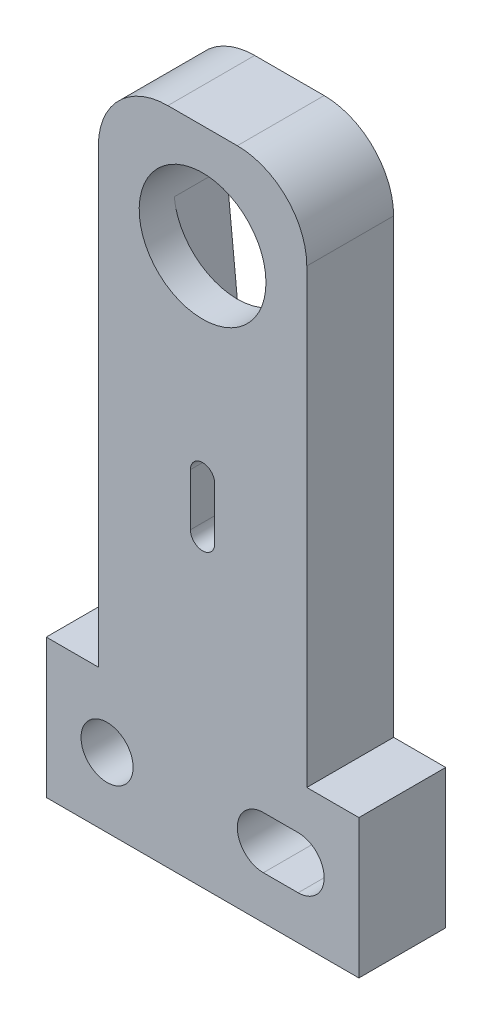
ISO-10303-21;
HEADER;
FILE_DESCRIPTION(('STEP AP214'),'2;1');
FILE_NAME('part.step','',(''),(''),'','','');
FILE_SCHEMA(('AUTOMOTIVE_DESIGN { 1 0 10303 214 1 1 1 1 }'));
ENDSEC;
DATA;
#1=APPLICATION_CONTEXT('core data for automotive mechanical design processes');
#2=APPLICATION_PROTOCOL_DEFINITION('international standard','automotive_design',2000,#1);
#3=PRODUCT_CONTEXT('',#1,'mechanical');
#4=PRODUCT('Part','Part','',(#3));
#5=PRODUCT_RELATED_PRODUCT_CATEGORY('part','',(#4));
#6=PRODUCT_DEFINITION_FORMATION('','',#4);
#7=PRODUCT_DEFINITION_CONTEXT('part definition',#1,'design');
#8=PRODUCT_DEFINITION('design','',#6,#7);
#9=PRODUCT_DEFINITION_SHAPE('','',#8);
#10=(LENGTH_UNIT() NAMED_UNIT(*) SI_UNIT(.MILLI.,.METRE.));
#11=(NAMED_UNIT(*) PLANE_ANGLE_UNIT() SI_UNIT($,.RADIAN.));
#12=(NAMED_UNIT(*) SI_UNIT($,.STERADIAN.) SOLID_ANGLE_UNIT());
#13=UNCERTAINTY_MEASURE_WITH_UNIT(LENGTH_MEASURE(1.E-05),#10,'distance_accuracy_value','');
#14=(GEOMETRIC_REPRESENTATION_CONTEXT(3) GLOBAL_UNCERTAINTY_ASSIGNED_CONTEXT((#13)) GLOBAL_UNIT_ASSIGNED_CONTEXT((#10,
#11,#12)) REPRESENTATION_CONTEXT('',''));
#15=CARTESIAN_POINT('',(0.,0.,0.));
#16=DIRECTION('',(0.,0.,1.));
#17=DIRECTION('',(1.,0.,0.));
#18=AXIS2_PLACEMENT_3D('',#15,#16,#17);
#19=CARTESIAN_POINT('',(0.,0.,5.));
#20=DIRECTION('',(0.,0.,-1.));
#21=DIRECTION('',(-1.,0.,0.));
#22=AXIS2_PLACEMENT_3D('',#19,#20,#21);
#23=CYLINDRICAL_SURFACE('',#22,3.65);
#24=CARTESIAN_POINT('',(0.,0.,5.));
#25=DIRECTION('',(0.,0.,1.));
#26=DIRECTION('',(1.,0.,0.));
#27=AXIS2_PLACEMENT_3D('',#24,#25,#26);
#28=CIRCLE('',#27,3.65);
#29=CARTESIAN_POINT('',(3.65,0.,5.));
#30=VERTEX_POINT('',#29);
#31=EDGE_CURVE('E382',#30,#30,#28,.T.);
#32=ORIENTED_EDGE('',*,*,#31,.T.);
#33=EDGE_LOOP('',(#32));
#34=FACE_BOUND('',#33,.T.);
#35=CARTESIAN_POINT('',(0.,0.,3.));
#36=DIRECTION('',(0.,0.,1.));
#37=DIRECTION('',(1.,0.,0.));
#38=AXIS2_PLACEMENT_3D('',#35,#36,#37);
#39=CIRCLE('',#38,3.65);
#40=CARTESIAN_POINT('',(-3.63170414543916,-0.365000000000001,3.));
#41=VERTEX_POINT('',#40);
#42=CARTESIAN_POINT('',(3.63170414543916,-0.365,3.));
#43=VERTEX_POINT('',#42);
#44=EDGE_CURVE('E408',#41,#43,#39,.T.);
#45=ORIENTED_EDGE('',*,*,#44,.F.);
#46=DIRECTION('',(0.,0.,-1.));
#47=VECTOR('',#46,1.);
#48=CARTESIAN_POINT('',(-3.63170414543916,-0.365000000000001,3.));
#49=LINE('',#48,#47);
#50=CARTESIAN_POINT('',(-3.63170414543916,-0.365000000000001,0.));
#51=VERTEX_POINT('',#50);
#52=EDGE_CURVE('E411',#41,#51,#49,.T.);
#53=ORIENTED_EDGE('',*,*,#52,.T.);
#54=CARTESIAN_POINT('',(0.,0.,0.));
#55=DIRECTION('',(0.,0.,1.));
#56=DIRECTION('',(1.,0.,0.));
#57=AXIS2_PLACEMENT_3D('',#54,#55,#56);
#58=CIRCLE('',#57,3.65);
#59=CARTESIAN_POINT('',(3.63170414543916,-0.365,0.));
#60=VERTEX_POINT('',#59);
#61=EDGE_CURVE('E258',#60,#51,#58,.T.);
#62=ORIENTED_EDGE('',*,*,#61,.F.);
#63=DIRECTION('',(0.,0.,-1.));
#64=VECTOR('',#63,1.);
#65=CARTESIAN_POINT('',(3.63170414543916,-0.365,3.));
#66=LINE('',#65,#64);
#67=EDGE_CURVE('E60',#43,#60,#66,.T.);
#68=ORIENTED_EDGE('',*,*,#67,.F.);
#69=EDGE_LOOP('',(#45,#53,#62,#68));
#70=FACE_BOUND('',#69,.T.);
#71=ADVANCED_FACE('F35',(#34,#70),#23,.F.);
#72=CARTESIAN_POINT('',(0.,0.,0.));
#73=DIRECTION('',(0.,0.,1.));
#74=DIRECTION('',(1.,0.,0.));
#75=AXIS2_PLACEMENT_3D('',#72,#73,#74);
#76=PLANE('',#75);
#77=CARTESIAN_POINT('',(-5.50000000000001,-28.,0.));
#78=DIRECTION('',(0.,0.,1.));
#79=DIRECTION('',(1.,0.,0.));
#80=AXIS2_PLACEMENT_3D('',#77,#78,#79);
#81=CIRCLE('',#80,1.5);
#82=CARTESIAN_POINT('',(-4.,-28.,0.));
#83=VERTEX_POINT('',#82);
#84=EDGE_CURVE('E261',#83,#83,#81,.T.);
#85=ORIENTED_EDGE('',*,*,#84,.T.);
#86=EDGE_LOOP('',(#85));
#87=FACE_BOUND('',#86,.T.);
#88=CARTESIAN_POINT('',(3.49999999999999,-28.,0.));
#89=DIRECTION('',(0.,0.,1.));
#90=DIRECTION('',(1.,0.,0.));
#91=AXIS2_PLACEMENT_3D('',#88,#89,#90);
#92=CIRCLE('',#91,1.5);
#93=CARTESIAN_POINT('',(3.49999999999999,-26.5,0.));
#94=VERTEX_POINT('',#93);
#95=CARTESIAN_POINT('',(3.49999999999999,-29.5,0.));
#96=VERTEX_POINT('',#95);
#97=EDGE_CURVE('E246',#94,#96,#92,.T.);
#98=ORIENTED_EDGE('',*,*,#97,.T.);
#99=DIRECTION('',(1.,0.,0.));
#100=VECTOR('',#99,1.);
#101=CARTESIAN_POINT('',(0.,-29.5,0.));
#102=LINE('',#101,#100);
#103=CARTESIAN_POINT('',(5.49999999999999,-29.5,0.));
#104=VERTEX_POINT('',#103);
#105=EDGE_CURVE('E255',#96,#104,#102,.T.);
#106=ORIENTED_EDGE('',*,*,#105,.T.);
#107=CARTESIAN_POINT('',(5.49999999999999,-28.,0.));
#108=DIRECTION('',(0.,0.,1.));
#109=DIRECTION('',(1.,0.,0.));
#110=AXIS2_PLACEMENT_3D('',#107,#108,#109);
#111=CIRCLE('',#110,1.5);
#112=CARTESIAN_POINT('',(5.49999999999999,-26.5,0.));
#113=VERTEX_POINT('',#112);
#114=EDGE_CURVE('E252',#104,#113,#111,.T.);
#115=ORIENTED_EDGE('',*,*,#114,.T.);
#116=DIRECTION('',(-1.,0.,0.));
#117=VECTOR('',#116,1.);
#118=CARTESIAN_POINT('',(0.,-26.5,0.));
#119=LINE('',#118,#117);
#120=EDGE_CURVE('E249',#113,#94,#119,.T.);
#121=ORIENTED_EDGE('',*,*,#120,.T.);
#122=EDGE_LOOP('',(#98,#106,#115,#121));
#123=FACE_BOUND('',#122,.T.);
#124=CARTESIAN_POINT('',(-2.,2.,0.));
#125=DIRECTION('',(0.,0.,1.));
#126=DIRECTION('',(1.,0.,0.));
#127=AXIS2_PLACEMENT_3D('',#124,#125,#126);
#128=CIRCLE('',#127,4.);
#129=CARTESIAN_POINT('',(-6.,2.,0.));
#130=VERTEX_POINT('',#129);
#131=CARTESIAN_POINT('',(-2.,6.,0.));
#132=VERTEX_POINT('',#131);
#133=EDGE_CURVE('E220',#130,#132,#128,.F.);
#134=ORIENTED_EDGE('',*,*,#133,.T.);
#135=DIRECTION('',(1.,0.,0.));
#136=VECTOR('',#135,1.);
#137=CARTESIAN_POINT('',(0.,6.,0.));
#138=LINE('',#137,#136);
#139=CARTESIAN_POINT('',(2.,6.,0.));
#140=VERTEX_POINT('',#139);
#141=EDGE_CURVE('E243',#132,#140,#138,.T.);
#142=ORIENTED_EDGE('',*,*,#141,.T.);
#143=CARTESIAN_POINT('',(2.,2.,0.));
#144=DIRECTION('',(0.,0.,1.));
#145=DIRECTION('',(1.,0.,0.));
#146=AXIS2_PLACEMENT_3D('',#143,#144,#145);
#147=CIRCLE('',#146,4.);
#148=CARTESIAN_POINT('',(6.,2.,0.));
#149=VERTEX_POINT('',#148);
#150=EDGE_CURVE('E240',#149,#140,#147,.T.);
#151=ORIENTED_EDGE('',*,*,#150,.F.);
#152=DIRECTION('',(0.,-1.,0.));
#153=VECTOR('',#152,1.);
#154=CARTESIAN_POINT('',(6.,0.,0.));
#155=LINE('',#154,#153);
#156=CARTESIAN_POINT('',(6.,-24.,0.));
#157=VERTEX_POINT('',#156);
#158=EDGE_CURVE('E237',#149,#157,#155,.T.);
#159=ORIENTED_EDGE('',*,*,#158,.T.);
#160=DIRECTION('',(-1.,0.,0.));
#161=VECTOR('',#160,1.);
#162=CARTESIAN_POINT('',(0.,-24.,0.));
#163=LINE('',#162,#161);
#164=CARTESIAN_POINT('',(9.,-24.,0.));
#165=VERTEX_POINT('',#164);
#166=EDGE_CURVE('E234',#165,#157,#163,.T.);
#167=ORIENTED_EDGE('',*,*,#166,.F.);
#168=DIRECTION('',(0.,1.,0.));
#169=VECTOR('',#168,1.);
#170=CARTESIAN_POINT('',(9.,0.,0.));
#171=LINE('',#170,#169);
#172=CARTESIAN_POINT('',(9.,-32.,0.));
#173=VERTEX_POINT('',#172);
#174=EDGE_CURVE('E232',#173,#165,#171,.T.);
#175=ORIENTED_EDGE('',*,*,#174,.F.);
#176=DIRECTION('',(1.,0.,0.));
#177=VECTOR('',#176,1.);
#178=CARTESIAN_POINT('',(0.,-32.,0.));
#179=LINE('',#178,#177);
#180=CARTESIAN_POINT('',(-8.99999999999999,-32.,0.));
#181=VERTEX_POINT('',#180);
#182=EDGE_CURVE('E230',#181,#173,#179,.T.);
#183=ORIENTED_EDGE('',*,*,#182,.F.);
#184=DIRECTION('',(0.,-1.,0.));
#185=VECTOR('',#184,1.);
#186=CARTESIAN_POINT('',(-8.99999999999999,0.,0.));
#187=LINE('',#186,#185);
#188=CARTESIAN_POINT('',(-8.99999999999999,-24.,0.));
#189=VERTEX_POINT('',#188);
#190=EDGE_CURVE('E228',#189,#181,#187,.T.);
#191=ORIENTED_EDGE('',*,*,#190,.F.);
#192=DIRECTION('',(-1.,0.,0.));
#193=VECTOR('',#192,1.);
#194=CARTESIAN_POINT('',(0.,-24.,0.));
#195=LINE('',#194,#193);
#196=CARTESIAN_POINT('',(-6.,-24.,0.));
#197=VERTEX_POINT('',#196);
#198=EDGE_CURVE('E226',#197,#189,#195,.T.);
#199=ORIENTED_EDGE('',*,*,#198,.F.);
#200=DIRECTION('',(0.,-1.,0.));
#201=VECTOR('',#200,1.);
#202=CARTESIAN_POINT('',(-6.,0.,0.));
#203=LINE('',#202,#201);
#204=EDGE_CURVE('E223',#130,#197,#203,.T.);
#205=ORIENTED_EDGE('',*,*,#204,.F.);
#206=EDGE_LOOP('',(#134,#142,#151,#159,#167,#175,#183,#191,#199,#205));
#207=FACE_BOUND('',#206,.T.);
#208=DIRECTION('',(0.1,-0.99498743710662,0.));
#209=VECTOR('',#208,1.);
#210=CARTESIAN_POINT('',(-3.63170414543916,-0.365,0.));
#211=LINE('',#210,#209);
#212=CARTESIAN_POINT('',(-2.23872173348989,-14.225,0.));
#213=VERTEX_POINT('',#212);
#214=EDGE_CURVE('E412',#51,#213,#211,.T.);
#215=ORIENTED_EDGE('',*,*,#214,.T.);
#216=CARTESIAN_POINT('',(0.,-14.,0.));
#217=DIRECTION('',(0.,0.,1.));
#218=DIRECTION('',(1.,0.,0.));
#219=AXIS2_PLACEMENT_3D('',#216,#217,#218);
#220=CIRCLE('',#219,2.25);
#221=CARTESIAN_POINT('',(2.2387217334899,-14.225,0.));
#222=VERTEX_POINT('',#221);
#223=EDGE_CURVE('E415',#213,#222,#220,.T.);
#224=ORIENTED_EDGE('',*,*,#223,.T.);
#225=DIRECTION('',(0.0999999999999999,0.99498743710662,0.));
#226=VECTOR('',#225,1.);
#227=CARTESIAN_POINT('',(3.63170414543916,-0.364999999999999,0.));
#228=LINE('',#227,#226);
#229=EDGE_CURVE('E200',#222,#60,#228,.T.);
#230=ORIENTED_EDGE('',*,*,#229,.T.);
#231=ORIENTED_EDGE('',*,*,#61,.T.);
#232=EDGE_LOOP('',(#215,#224,#230,#231));
#233=FACE_BOUND('',#232,.T.);
#234=ADVANCED_FACE('F312',(#87,#123,#207,#233),#76,.F.);
#235=CARTESIAN_POINT('',(0.,-11.5,5.));
#236=DIRECTION('',(0.,0.,-1.));
#237=DIRECTION('',(-1.,0.,0.));
#238=AXIS2_PLACEMENT_3D('',#235,#236,#237);
#239=CYLINDRICAL_SURFACE('',#238,0.7);
#240=CARTESIAN_POINT('',(0.,-11.5,3.));
#241=DIRECTION('',(0.,0.,1.));
#242=DIRECTION('',(1.,0.,0.));
#243=AXIS2_PLACEMENT_3D('',#240,#241,#242);
#244=CIRCLE('',#243,0.7);
#245=CARTESIAN_POINT('',(0.7,-11.5,3.));
#246=VERTEX_POINT('',#245);
#247=CARTESIAN_POINT('',(-0.7,-11.5,3.));
#248=VERTEX_POINT('',#247);
#249=EDGE_CURVE('E52',#246,#248,#244,.T.);
#250=ORIENTED_EDGE('',*,*,#249,.F.);
#251=DIRECTION('',(0.,0.,-1.));
#252=VECTOR('',#251,1.);
#253=CARTESIAN_POINT('',(0.7,-11.5,5.));
#254=LINE('',#253,#252);
#255=CARTESIAN_POINT('',(0.7,-11.5,5.));
#256=VERTEX_POINT('',#255);
#257=EDGE_CURVE('E11',#256,#246,#254,.T.);
#258=ORIENTED_EDGE('',*,*,#257,.F.);
#259=CARTESIAN_POINT('',(0.,-11.5,5.));
#260=DIRECTION('',(0.,0.,1.));
#261=DIRECTION('',(1.,0.,0.));
#262=AXIS2_PLACEMENT_3D('',#259,#260,#261);
#263=CIRCLE('',#262,0.7);
#264=CARTESIAN_POINT('',(-0.7,-11.5,5.));
#265=VERTEX_POINT('',#264);
#266=EDGE_CURVE('E210',#256,#265,#263,.T.);
#267=ORIENTED_EDGE('',*,*,#266,.T.);
#268=DIRECTION('',(0.,0.,-1.));
#269=VECTOR('',#268,1.);
#270=CARTESIAN_POINT('',(-0.7,-11.5,5.));
#271=LINE('',#270,#269);
#272=EDGE_CURVE('E199',#265,#248,#271,.T.);
#273=ORIENTED_EDGE('',*,*,#272,.T.);
#274=EDGE_LOOP('',(#250,#258,#267,#273));
#275=FACE_BOUND('',#274,.T.);
#276=ADVANCED_FACE('F195',(#275),#239,.F.);
#277=CARTESIAN_POINT('',(0.699999999999998,0.,5.));
#278=DIRECTION('',(-1.,0.,0.));
#279=DIRECTION('',(0.,-1.,0.));
#280=AXIS2_PLACEMENT_3D('',#277,#278,#279);
#281=PLANE('',#280);
#282=DIRECTION('',(0.,1.,0.));
#283=VECTOR('',#282,1.);
#284=CARTESIAN_POINT('',(0.699999999999998,0.,3.));
#285=LINE('',#284,#283);
#286=CARTESIAN_POINT('',(0.700000000000001,-14.5,3.));
#287=VERTEX_POINT('',#286);
#288=EDGE_CURVE('E185',#287,#246,#285,.T.);
#289=ORIENTED_EDGE('',*,*,#288,.F.);
#290=DIRECTION('',(0.,0.,-1.));
#291=VECTOR('',#290,1.);
#292=CARTESIAN_POINT('',(0.700000000000001,-14.5,5.));
#293=LINE('',#292,#291);
#294=CARTESIAN_POINT('',(0.700000000000001,-14.5,5.));
#295=VERTEX_POINT('',#294);
#296=EDGE_CURVE('E44',#295,#287,#293,.T.);
#297=ORIENTED_EDGE('',*,*,#296,.F.);
#298=DIRECTION('',(0.,1.,0.));
#299=VECTOR('',#298,1.);
#300=CARTESIAN_POINT('',(0.699999999999998,0.,5.));
#301=LINE('',#300,#299);
#302=EDGE_CURVE('E205',#295,#256,#301,.T.);
#303=ORIENTED_EDGE('',*,*,#302,.T.);
#304=ORIENTED_EDGE('',*,*,#257,.T.);
#305=EDGE_LOOP('',(#289,#297,#303,#304));
#306=FACE_BOUND('',#305,.T.);
#307=ADVANCED_FACE('F203',(#306),#281,.T.);
#308=CARTESIAN_POINT('',(0.,-14.5,5.));
#309=DIRECTION('',(0.,0.,-1.));
#310=DIRECTION('',(-1.,0.,0.));
#311=AXIS2_PLACEMENT_3D('',#308,#309,#310);
#312=CYLINDRICAL_SURFACE('',#311,0.7);
#313=CARTESIAN_POINT('',(0.,-14.5,3.));
#314=DIRECTION('',(0.,0.,1.));
#315=DIRECTION('',(1.,0.,0.));
#316=AXIS2_PLACEMENT_3D('',#313,#314,#315);
#317=CIRCLE('',#316,0.7);
#318=CARTESIAN_POINT('',(-0.699999999999999,-14.5,3.));
#319=VERTEX_POINT('',#318);
#320=EDGE_CURVE('E189',#319,#287,#317,.T.);
#321=ORIENTED_EDGE('',*,*,#320,.F.);
#322=DIRECTION('',(0.,0.,-1.));
#323=VECTOR('',#322,1.);
#324=CARTESIAN_POINT('',(-0.699999999999999,-14.5,5.));
#325=LINE('',#324,#323);
#326=CARTESIAN_POINT('',(-0.699999999999999,-14.5,5.));
#327=VERTEX_POINT('',#326);
#328=EDGE_CURVE('E266',#327,#319,#325,.T.);
#329=ORIENTED_EDGE('',*,*,#328,.F.);
#330=CARTESIAN_POINT('',(0.,-14.5,5.));
#331=DIRECTION('',(0.,0.,1.));
#332=DIRECTION('',(1.,0.,0.));
#333=AXIS2_PLACEMENT_3D('',#330,#331,#332);
#334=CIRCLE('',#333,0.7);
#335=EDGE_CURVE('E209',#327,#295,#334,.T.);
#336=ORIENTED_EDGE('',*,*,#335,.T.);
#337=ORIENTED_EDGE('',*,*,#296,.T.);
#338=EDGE_LOOP('',(#321,#329,#336,#337));
#339=FACE_BOUND('',#338,.T.);
#340=ADVANCED_FACE('F470',(#339),#312,.F.);
#341=CARTESIAN_POINT('',(3.49999999999999,-28.,5.));
#342=DIRECTION('',(0.,0.,-1.));
#343=DIRECTION('',(-1.,0.,0.));
#344=AXIS2_PLACEMENT_3D('',#341,#342,#343);
#345=CYLINDRICAL_SURFACE('',#344,1.5);
#346=ORIENTED_EDGE('',*,*,#97,.F.);
#347=DIRECTION('',(0.,0.,-1.));
#348=VECTOR('',#347,1.);
#349=CARTESIAN_POINT('',(3.49999999999999,-26.5,5.));
#350=LINE('',#349,#348);
#351=CARTESIAN_POINT('',(3.49999999999999,-26.5,5.));
#352=VERTEX_POINT('',#351);
#353=EDGE_CURVE('E267',#352,#94,#350,.T.);
#354=ORIENTED_EDGE('',*,*,#353,.F.);
#355=CARTESIAN_POINT('',(3.49999999999999,-28.,5.));
#356=DIRECTION('',(0.,0.,1.));
#357=DIRECTION('',(1.,0.,0.));
#358=AXIS2_PLACEMENT_3D('',#355,#356,#357);
#359=CIRCLE('',#358,1.5);
#360=CARTESIAN_POINT('',(3.49999999999999,-29.5,5.));
#361=VERTEX_POINT('',#360);
#362=EDGE_CURVE('E370',#352,#361,#359,.T.);
#363=ORIENTED_EDGE('',*,*,#362,.T.);
#364=DIRECTION('',(0.,0.,-1.));
#365=VECTOR('',#364,1.);
#366=CARTESIAN_POINT('',(3.49999999999999,-29.5,5.));
#367=LINE('',#366,#365);
#368=EDGE_CURVE('E271',#361,#96,#367,.T.);
#369=ORIENTED_EDGE('',*,*,#368,.T.);
#370=EDGE_LOOP('',(#346,#354,#363,#369));
#371=FACE_BOUND('',#370,.T.);
#372=ADVANCED_FACE('F466',(#371),#345,.F.);
#373=CARTESIAN_POINT('',(0.,-26.5,5.));
#374=DIRECTION('',(0.,-1.,0.));
#375=DIRECTION('',(0.,0.,-1.));
#376=AXIS2_PLACEMENT_3D('',#373,#374,#375);
#377=PLANE('',#376);
#378=ORIENTED_EDGE('',*,*,#120,.F.);
#379=DIRECTION('',(0.,0.,-1.));
#380=VECTOR('',#379,1.);
#381=CARTESIAN_POINT('',(5.49999999999999,-26.5,5.));
#382=LINE('',#381,#380);
#383=CARTESIAN_POINT('',(5.49999999999999,-26.5,5.));
#384=VERTEX_POINT('',#383);
#385=EDGE_CURVE('E275',#384,#113,#382,.T.);
#386=ORIENTED_EDGE('',*,*,#385,.F.);
#387=DIRECTION('',(-1.,0.,0.));
#388=VECTOR('',#387,1.);
#389=CARTESIAN_POINT('',(0.,-26.5,5.));
#390=LINE('',#389,#388);
#391=EDGE_CURVE('E373',#384,#352,#390,.T.);
#392=ORIENTED_EDGE('',*,*,#391,.T.);
#393=ORIENTED_EDGE('',*,*,#353,.T.);
#394=EDGE_LOOP('',(#378,#386,#392,#393));
#395=FACE_BOUND('',#394,.T.);
#396=ADVANCED_FACE('F462',(#395),#377,.T.);
#397=CARTESIAN_POINT('',(5.49999999999999,-28.,5.));
#398=DIRECTION('',(0.,0.,-1.));
#399=DIRECTION('',(-1.,0.,0.));
#400=AXIS2_PLACEMENT_3D('',#397,#398,#399);
#401=CYLINDRICAL_SURFACE('',#400,1.5);
#402=ORIENTED_EDGE('',*,*,#114,.F.);
#403=DIRECTION('',(0.,0.,-1.));
#404=VECTOR('',#403,1.);
#405=CARTESIAN_POINT('',(5.49999999999999,-29.5,5.));
#406=LINE('',#405,#404);
#407=CARTESIAN_POINT('',(5.49999999999999,-29.5,5.));
#408=VERTEX_POINT('',#407);
#409=EDGE_CURVE('E273',#408,#104,#406,.T.);
#410=ORIENTED_EDGE('',*,*,#409,.F.);
#411=CARTESIAN_POINT('',(5.49999999999999,-28.,5.));
#412=DIRECTION('',(0.,0.,1.));
#413=DIRECTION('',(1.,0.,0.));
#414=AXIS2_PLACEMENT_3D('',#411,#412,#413);
#415=CIRCLE('',#414,1.5);
#416=EDGE_CURVE('E376',#408,#384,#415,.T.);
#417=ORIENTED_EDGE('',*,*,#416,.T.);
#418=ORIENTED_EDGE('',*,*,#385,.T.);
#419=EDGE_LOOP('',(#402,#410,#417,#418));
#420=FACE_BOUND('',#419,.T.);
#421=ADVANCED_FACE('F459',(#420),#401,.F.);
#422=CARTESIAN_POINT('',(-2.,2.,5.));
#423=DIRECTION('',(0.,0.,-1.));
#424=DIRECTION('',(-1.,0.,0.));
#425=AXIS2_PLACEMENT_3D('',#422,#423,#424);
#426=CYLINDRICAL_SURFACE('',#425,4.);
#427=ORIENTED_EDGE('',*,*,#133,.F.);
#428=DIRECTION('',(0.,0.,-1.));
#429=VECTOR('',#428,1.);
#430=CARTESIAN_POINT('',(-6.,2.,5.));
#431=LINE('',#430,#429);
#432=CARTESIAN_POINT('',(-6.,2.,5.));
#433=VERTEX_POINT('',#432);
#434=EDGE_CURVE('E39',#433,#130,#431,.T.);
#435=ORIENTED_EDGE('',*,*,#434,.F.);
#436=CARTESIAN_POINT('',(-2.,2.,5.));
#437=DIRECTION('',(0.,0.,1.));
#438=DIRECTION('',(1.,0.,0.));
#439=AXIS2_PLACEMENT_3D('',#436,#437,#438);
#440=CIRCLE('',#439,4.);
#441=CARTESIAN_POINT('',(-2.,6.,5.));
#442=VERTEX_POINT('',#441);
#443=EDGE_CURVE('E264',#433,#442,#440,.F.);
#444=ORIENTED_EDGE('',*,*,#443,.T.);
#445=DIRECTION('',(0.,0.,-1.));
#446=VECTOR('',#445,1.);
#447=CARTESIAN_POINT('',(-2.,6.,5.));
#448=LINE('',#447,#446);
#449=EDGE_CURVE('E219',#442,#132,#448,.T.);
#450=ORIENTED_EDGE('',*,*,#449,.T.);
#451=EDGE_LOOP('',(#427,#435,#444,#450));
#452=FACE_BOUND('',#451,.T.);
#453=ADVANCED_FACE('F37',(#452),#426,.T.);
#454=CARTESIAN_POINT('',(-6.,0.,5.));
#455=DIRECTION('',(1.,0.,0.));
#456=DIRECTION('',(0.,1.,0.));
#457=AXIS2_PLACEMENT_3D('',#454,#455,#456);
#458=PLANE('',#457);
#459=ORIENTED_EDGE('',*,*,#204,.T.);
#460=DIRECTION('',(0.,0.,-1.));
#461=VECTOR('',#460,1.);
#462=CARTESIAN_POINT('',(-6.,-24.,5.));
#463=LINE('',#462,#461);
#464=CARTESIAN_POINT('',(-6.,-24.,5.));
#465=VERTEX_POINT('',#464);
#466=EDGE_CURVE('E296',#465,#197,#463,.T.);
#467=ORIENTED_EDGE('',*,*,#466,.F.);
#468=DIRECTION('',(0.,-1.,0.));
#469=VECTOR('',#468,1.);
#470=CARTESIAN_POINT('',(-6.,0.,5.));
#471=LINE('',#470,#469);
#472=EDGE_CURVE('E306',#433,#465,#471,.T.);
#473=ORIENTED_EDGE('',*,*,#472,.F.);
#474=ORIENTED_EDGE('',*,*,#434,.T.);
#475=EDGE_LOOP('',(#459,#467,#473,#474));
#476=FACE_BOUND('',#475,.T.);
#477=ADVANCED_FACE('F305',(#476),#458,.F.);
#478=CARTESIAN_POINT('',(0.,-24.,5.));
#479=DIRECTION('',(0.,-1.,0.));
#480=DIRECTION('',(0.,0.,-1.));
#481=AXIS2_PLACEMENT_3D('',#478,#479,#480);
#482=PLANE('',#481);
#483=ORIENTED_EDGE('',*,*,#198,.T.);
#484=DIRECTION('',(0.,0.,-1.));
#485=VECTOR('',#484,1.);
#486=CARTESIAN_POINT('',(-8.99999999999999,-24.,5.));
#487=LINE('',#486,#485);
#488=CARTESIAN_POINT('',(-8.99999999999999,-24.,5.));
#489=VERTEX_POINT('',#488);
#490=EDGE_CURVE('E294',#489,#189,#487,.T.);
#491=ORIENTED_EDGE('',*,*,#490,.F.);
#492=DIRECTION('',(-1.,0.,0.));
#493=VECTOR('',#492,1.);
#494=CARTESIAN_POINT('',(0.,-24.,5.));
#495=LINE('',#494,#493);
#496=EDGE_CURVE('E355',#465,#489,#495,.T.);
#497=ORIENTED_EDGE('',*,*,#496,.F.);
#498=ORIENTED_EDGE('',*,*,#466,.T.);
#499=EDGE_LOOP('',(#483,#491,#497,#498));
#500=FACE_BOUND('',#499,.T.);
#501=ADVANCED_FACE('F354',(#500),#482,.F.);
#502=CARTESIAN_POINT('',(-8.99999999999999,0.,5.));
#503=DIRECTION('',(1.,0.,0.));
#504=DIRECTION('',(0.,0.,-1.));
#505=AXIS2_PLACEMENT_3D('',#502,#503,#504);
#506=PLANE('',#505);
#507=ORIENTED_EDGE('',*,*,#190,.T.);
#508=DIRECTION('',(0.,0.,-1.));
#509=VECTOR('',#508,1.);
#510=CARTESIAN_POINT('',(-8.99999999999999,-32.,5.));
#511=LINE('',#510,#509);
#512=CARTESIAN_POINT('',(-8.99999999999999,-32.,5.));
#513=VERTEX_POINT('',#512);
#514=EDGE_CURVE('E291',#513,#181,#511,.T.);
#515=ORIENTED_EDGE('',*,*,#514,.F.);
#516=DIRECTION('',(0.,-1.,0.));
#517=VECTOR('',#516,1.);
#518=CARTESIAN_POINT('',(-8.99999999999999,0.,5.));
#519=LINE('',#518,#517);
#520=EDGE_CURVE('E352',#489,#513,#519,.T.);
#521=ORIENTED_EDGE('',*,*,#520,.F.);
#522=ORIENTED_EDGE('',*,*,#490,.T.);
#523=EDGE_LOOP('',(#507,#515,#521,#522));
#524=FACE_BOUND('',#523,.T.);
#525=ADVANCED_FACE('F351',(#524),#506,.F.);
#526=CARTESIAN_POINT('',(0.,-32.,5.));
#527=DIRECTION('',(0.,1.,0.));
#528=DIRECTION('',(0.,0.,1.));
#529=AXIS2_PLACEMENT_3D('',#526,#527,#528);
#530=PLANE('',#529);
#531=ORIENTED_EDGE('',*,*,#182,.T.);
#532=DIRECTION('',(0.,0.,-1.));
#533=VECTOR('',#532,1.);
#534=CARTESIAN_POINT('',(9.,-32.,5.));
#535=LINE('',#534,#533);
#536=CARTESIAN_POINT('',(9.,-32.,5.));
#537=VERTEX_POINT('',#536);
#538=EDGE_CURVE('E288',#537,#173,#535,.T.);
#539=ORIENTED_EDGE('',*,*,#538,.F.);
#540=DIRECTION('',(1.,0.,0.));
#541=VECTOR('',#540,1.);
#542=CARTESIAN_POINT('',(0.,-32.,5.));
#543=LINE('',#542,#541);
#544=EDGE_CURVE('E347',#513,#537,#543,.T.);
#545=ORIENTED_EDGE('',*,*,#544,.F.);
#546=ORIENTED_EDGE('',*,*,#514,.T.);
#547=EDGE_LOOP('',(#531,#539,#545,#546));
#548=FACE_BOUND('',#547,.T.);
#549=ADVANCED_FACE('F346',(#548),#530,.F.);
#550=CARTESIAN_POINT('',(9.,0.,5.));
#551=DIRECTION('',(-1.,0.,0.));
#552=DIRECTION('',(0.,0.,1.));
#553=AXIS2_PLACEMENT_3D('',#550,#551,#552);
#554=PLANE('',#553);
#555=ORIENTED_EDGE('',*,*,#174,.T.);
#556=DIRECTION('',(0.,0.,-1.));
#557=VECTOR('',#556,1.);
#558=CARTESIAN_POINT('',(9.,-24.,5.));
#559=LINE('',#558,#557);
#560=CARTESIAN_POINT('',(9.,-24.,5.));
#561=VERTEX_POINT('',#560);
#562=EDGE_CURVE('E285',#561,#165,#559,.T.);
#563=ORIENTED_EDGE('',*,*,#562,.F.);
#564=DIRECTION('',(0.,1.,0.));
#565=VECTOR('',#564,1.);
#566=CARTESIAN_POINT('',(9.,0.,5.));
#567=LINE('',#566,#565);
#568=EDGE_CURVE('E343',#537,#561,#567,.T.);
#569=ORIENTED_EDGE('',*,*,#568,.F.);
#570=ORIENTED_EDGE('',*,*,#538,.T.);
#571=EDGE_LOOP('',(#555,#563,#569,#570));
#572=FACE_BOUND('',#571,.T.);
#573=ADVANCED_FACE('F340',(#572),#554,.F.);
#574=CARTESIAN_POINT('',(0.,-24.,5.));
#575=DIRECTION('',(0.,-1.,0.));
#576=DIRECTION('',(1.,0.,0.));
#577=AXIS2_PLACEMENT_3D('',#574,#575,#576);
#578=PLANE('',#577);
#579=ORIENTED_EDGE('',*,*,#166,.T.);
#580=DIRECTION('',(0.,0.,-1.));
#581=VECTOR('',#580,1.);
#582=CARTESIAN_POINT('',(6.,-24.,5.));
#583=LINE('',#582,#581);
#584=CARTESIAN_POINT('',(6.,-24.,5.));
#585=VERTEX_POINT('',#584);
#586=EDGE_CURVE('E283',#585,#157,#583,.T.);
#587=ORIENTED_EDGE('',*,*,#586,.F.);
#588=DIRECTION('',(-1.,0.,0.));
#589=VECTOR('',#588,1.);
#590=CARTESIAN_POINT('',(0.,-24.,5.));
#591=LINE('',#590,#589);
#592=EDGE_CURVE('E364',#561,#585,#591,.T.);
#593=ORIENTED_EDGE('',*,*,#592,.F.);
#594=ORIENTED_EDGE('',*,*,#562,.T.);
#595=EDGE_LOOP('',(#579,#587,#593,#594));
#596=FACE_BOUND('',#595,.T.);
#597=ADVANCED_FACE('F335',(#596),#578,.F.);
#598=CARTESIAN_POINT('',(6.,0.,5.));
#599=DIRECTION('',(1.,0.,0.));
#600=DIRECTION('',(0.,1.,0.));
#601=AXIS2_PLACEMENT_3D('',#598,#599,#600);
#602=PLANE('',#601);
#603=ORIENTED_EDGE('',*,*,#158,.F.);
#604=DIRECTION('',(0.,0.,-1.));
#605=VECTOR('',#604,1.);
#606=CARTESIAN_POINT('',(6.,2.,5.));
#607=LINE('',#606,#605);
#608=CARTESIAN_POINT('',(6.,2.,5.));
#609=VERTEX_POINT('',#608);
#610=EDGE_CURVE('E281',#609,#149,#607,.T.);
#611=ORIENTED_EDGE('',*,*,#610,.F.);
#612=DIRECTION('',(0.,-1.,0.));
#613=VECTOR('',#612,1.);
#614=CARTESIAN_POINT('',(6.,0.,5.));
#615=LINE('',#614,#613);
#616=EDGE_CURVE('E332',#609,#585,#615,.T.);
#617=ORIENTED_EDGE('',*,*,#616,.T.);
#618=ORIENTED_EDGE('',*,*,#586,.T.);
#619=EDGE_LOOP('',(#603,#611,#617,#618));
#620=FACE_BOUND('',#619,.T.);
#621=ADVANCED_FACE('F327',(#620),#602,.T.);
#622=CARTESIAN_POINT('',(2.,2.,5.));
#623=DIRECTION('',(0.,0.,-1.));
#624=DIRECTION('',(-1.,0.,0.));
#625=AXIS2_PLACEMENT_3D('',#622,#623,#624);
#626=CYLINDRICAL_SURFACE('',#625,4.);
#627=ORIENTED_EDGE('',*,*,#150,.T.);
#628=DIRECTION('',(0.,0.,-1.));
#629=VECTOR('',#628,1.);
#630=CARTESIAN_POINT('',(2.,6.,5.));
#631=LINE('',#630,#629);
#632=CARTESIAN_POINT('',(2.,6.,5.));
#633=VERTEX_POINT('',#632);
#634=EDGE_CURVE('E279',#633,#140,#631,.T.);
#635=ORIENTED_EDGE('',*,*,#634,.F.);
#636=CARTESIAN_POINT('',(2.,2.,5.));
#637=DIRECTION('',(0.,0.,1.));
#638=DIRECTION('',(1.,0.,0.));
#639=AXIS2_PLACEMENT_3D('',#636,#637,#638);
#640=CIRCLE('',#639,4.);
#641=EDGE_CURVE('E367',#609,#633,#640,.T.);
#642=ORIENTED_EDGE('',*,*,#641,.F.);
#643=ORIENTED_EDGE('',*,*,#610,.T.);
#644=EDGE_LOOP('',(#627,#635,#642,#643));
#645=FACE_BOUND('',#644,.T.);
#646=ADVANCED_FACE('F474',(#645),#626,.T.);
#647=CARTESIAN_POINT('',(-5.50000000000001,-28.,5.));
#648=DIRECTION('',(0.,0.,-1.));
#649=DIRECTION('',(-1.,0.,0.));
#650=AXIS2_PLACEMENT_3D('',#647,#648,#649);
#651=CYLINDRICAL_SURFACE('',#650,1.5);
#652=CARTESIAN_POINT('',(-5.50000000000001,-28.,5.));
#653=DIRECTION('',(0.,0.,1.));
#654=DIRECTION('',(1.,0.,0.));
#655=AXIS2_PLACEMENT_3D('',#652,#653,#654);
#656=CIRCLE('',#655,1.5);
#657=CARTESIAN_POINT('',(-4.,-28.,5.));
#658=VERTEX_POINT('',#657);
#659=EDGE_CURVE('E214',#658,#658,#656,.T.);
#660=ORIENTED_EDGE('',*,*,#659,.T.);
#661=EDGE_LOOP('',(#660));
#662=FACE_BOUND('',#661,.T.);
#663=ORIENTED_EDGE('',*,*,#84,.F.);
#664=EDGE_LOOP('',(#663));
#665=FACE_BOUND('',#664,.T.);
#666=ADVANCED_FACE('F387',(#662,#665),#651,.F.);
#667=CARTESIAN_POINT('',(0.,-29.5,5.));
#668=DIRECTION('',(0.,1.,0.));
#669=DIRECTION('',(0.,0.,1.));
#670=AXIS2_PLACEMENT_3D('',#667,#668,#669);
#671=PLANE('',#670);
#672=ORIENTED_EDGE('',*,*,#105,.F.);
#673=ORIENTED_EDGE('',*,*,#368,.F.);
#674=DIRECTION('',(1.,0.,0.));
#675=VECTOR('',#674,1.);
#676=CARTESIAN_POINT('',(0.,-29.5,5.));
#677=LINE('',#676,#675);
#678=EDGE_CURVE('E379',#361,#408,#677,.T.);
#679=ORIENTED_EDGE('',*,*,#678,.T.);
#680=ORIENTED_EDGE('',*,*,#409,.T.);
#681=EDGE_LOOP('',(#672,#673,#679,#680));
#682=FACE_BOUND('',#681,.T.);
#683=ADVANCED_FACE('F455',(#682),#671,.T.);
#684=CARTESIAN_POINT('',(0.,6.,5.));
#685=DIRECTION('',(0.,1.,0.));
#686=DIRECTION('',(0.,0.,1.));
#687=AXIS2_PLACEMENT_3D('',#684,#685,#686);
#688=PLANE('',#687);
#689=ORIENTED_EDGE('',*,*,#141,.F.);
#690=ORIENTED_EDGE('',*,*,#449,.F.);
#691=DIRECTION('',(1.,0.,0.));
#692=VECTOR('',#691,1.);
#693=CARTESIAN_POINT('',(0.,6.,5.));
#694=LINE('',#693,#692);
#695=EDGE_CURVE('E320',#442,#633,#694,.T.);
#696=ORIENTED_EDGE('',*,*,#695,.T.);
#697=ORIENTED_EDGE('',*,*,#634,.T.);
#698=EDGE_LOOP('',(#689,#690,#696,#697));
#699=FACE_BOUND('',#698,.T.);
#700=ADVANCED_FACE('F319',(#699),#688,.T.);
#701=CARTESIAN_POINT('',(-0.700000000000002,0.,5.));
#702=DIRECTION('',(-1.,0.,0.));
#703=DIRECTION('',(0.,-1.,0.));
#704=AXIS2_PLACEMENT_3D('',#701,#702,#703);
#705=PLANE('',#704);
#706=ORIENTED_EDGE('',*,*,#328,.T.);
#707=DIRECTION('',(0.,1.,0.));
#708=VECTOR('',#707,1.);
#709=CARTESIAN_POINT('',(-0.700000000000002,0.,3.));
#710=LINE('',#709,#708);
#711=EDGE_CURVE('E397',#319,#248,#710,.T.);
#712=ORIENTED_EDGE('',*,*,#711,.T.);
#713=ORIENTED_EDGE('',*,*,#272,.F.);
#714=DIRECTION('',(0.,1.,0.));
#715=VECTOR('',#714,1.);
#716=CARTESIAN_POINT('',(-0.700000000000002,0.,5.));
#717=LINE('',#716,#715);
#718=EDGE_CURVE('E212',#327,#265,#717,.T.);
#719=ORIENTED_EDGE('',*,*,#718,.F.);
#720=EDGE_LOOP('',(#706,#712,#713,#719));
#721=FACE_BOUND('',#720,.T.);
#722=ADVANCED_FACE('F393',(#721),#705,.F.);
#723=CARTESIAN_POINT('',(0.,0.,5.));
#724=DIRECTION('',(0.,0.,1.));
#725=DIRECTION('',(1.,0.,0.));
#726=AXIS2_PLACEMENT_3D('',#723,#724,#725);
#727=PLANE('',#726);
#728=ORIENTED_EDGE('',*,*,#443,.F.);
#729=ORIENTED_EDGE('',*,*,#472,.T.);
#730=ORIENTED_EDGE('',*,*,#496,.T.);
#731=ORIENTED_EDGE('',*,*,#520,.T.);
#732=ORIENTED_EDGE('',*,*,#544,.T.);
#733=ORIENTED_EDGE('',*,*,#568,.T.);
#734=ORIENTED_EDGE('',*,*,#592,.T.);
#735=ORIENTED_EDGE('',*,*,#616,.F.);
#736=ORIENTED_EDGE('',*,*,#641,.T.);
#737=ORIENTED_EDGE('',*,*,#695,.F.);
#738=EDGE_LOOP('',(#728,#729,#730,#731,#732,#733,#734,#735,#736,#737));
#739=FACE_BOUND('',#738,.T.);
#740=ORIENTED_EDGE('',*,*,#362,.F.);
#741=ORIENTED_EDGE('',*,*,#391,.F.);
#742=ORIENTED_EDGE('',*,*,#416,.F.);
#743=ORIENTED_EDGE('',*,*,#678,.F.);
#744=EDGE_LOOP('',(#740,#741,#742,#743));
#745=FACE_BOUND('',#744,.T.);
#746=ORIENTED_EDGE('',*,*,#31,.F.);
#747=EDGE_LOOP('',(#746));
#748=FACE_BOUND('',#747,.T.);
#749=ORIENTED_EDGE('',*,*,#659,.F.);
#750=EDGE_LOOP('',(#749));
#751=FACE_BOUND('',#750,.T.);
#752=ORIENTED_EDGE('',*,*,#266,.F.);
#753=ORIENTED_EDGE('',*,*,#302,.F.);
#754=ORIENTED_EDGE('',*,*,#335,.F.);
#755=ORIENTED_EDGE('',*,*,#718,.T.);
#756=EDGE_LOOP('',(#752,#753,#754,#755));
#757=FACE_BOUND('',#756,.T.);
#758=ADVANCED_FACE('F390',(#739,#745,#748,#751,#757),#727,.T.);
#759=CARTESIAN_POINT('',(-3.63170414543916,-0.365,3.));
#760=DIRECTION('',(0.99498743710662,0.1,0.));
#761=DIRECTION('',(-0.1,0.99498743710662,0.));
#762=AXIS2_PLACEMENT_3D('',#759,#760,#761);
#763=PLANE('',#762);
#764=ORIENTED_EDGE('',*,*,#214,.F.);
#765=ORIENTED_EDGE('',*,*,#52,.F.);
#766=DIRECTION('',(0.1,-0.99498743710662,0.));
#767=VECTOR('',#766,1.);
#768=CARTESIAN_POINT('',(-3.63170414543916,-0.365,3.));
#769=LINE('',#768,#767);
#770=CARTESIAN_POINT('',(-2.23872173348989,-14.225,3.));
#771=VERTEX_POINT('',#770);
#772=EDGE_CURVE('E398',#41,#771,#769,.T.);
#773=ORIENTED_EDGE('',*,*,#772,.T.);
#774=DIRECTION('',(0.,0.,-1.));
#775=VECTOR('',#774,1.);
#776=CARTESIAN_POINT('',(-2.23872173348989,-14.225,3.));
#777=LINE('',#776,#775);
#778=EDGE_CURVE('E224',#771,#213,#777,.T.);
#779=ORIENTED_EDGE('',*,*,#778,.T.);
#780=EDGE_LOOP('',(#764,#765,#773,#779));
#781=FACE_BOUND('',#780,.T.);
#782=ADVANCED_FACE('F392',(#781),#763,.T.);
#783=CARTESIAN_POINT('',(0.,-14.,3.));
#784=DIRECTION('',(0.,0.,-1.));
#785=DIRECTION('',(-1.,0.,0.));
#786=AXIS2_PLACEMENT_3D('',#783,#784,#785);
#787=CYLINDRICAL_SURFACE('',#786,2.25);
#788=ORIENTED_EDGE('',*,*,#223,.F.);
#789=ORIENTED_EDGE('',*,*,#778,.F.);
#790=CARTESIAN_POINT('',(0.,-14.,3.));
#791=DIRECTION('',(0.,0.,1.));
#792=DIRECTION('',(1.,0.,0.));
#793=AXIS2_PLACEMENT_3D('',#790,#791,#792);
#794=CIRCLE('',#793,2.25);
#795=CARTESIAN_POINT('',(2.2387217334899,-14.225,3.));
#796=VERTEX_POINT('',#795);
#797=EDGE_CURVE('E401',#771,#796,#794,.T.);
#798=ORIENTED_EDGE('',*,*,#797,.T.);
#799=DIRECTION('',(0.,0.,-1.));
#800=VECTOR('',#799,1.);
#801=CARTESIAN_POINT('',(2.2387217334899,-14.225,3.));
#802=LINE('',#801,#800);
#803=EDGE_CURVE('E422',#796,#222,#802,.T.);
#804=ORIENTED_EDGE('',*,*,#803,.T.);
#805=EDGE_LOOP('',(#788,#789,#798,#804));
#806=FACE_BOUND('',#805,.T.);
#807=ADVANCED_FACE('F434',(#806),#787,.F.);
#808=CARTESIAN_POINT('',(3.63170414543916,-0.364999999999999,3.));
#809=DIRECTION('',(-0.99498743710662,0.0999999999999998,0.));
#810=DIRECTION('',(-0.0999999999999998,-0.99498743710662,0.));
#811=AXIS2_PLACEMENT_3D('',#808,#809,#810);
#812=PLANE('',#811);
#813=ORIENTED_EDGE('',*,*,#229,.F.);
#814=ORIENTED_EDGE('',*,*,#803,.F.);
#815=DIRECTION('',(0.0999999999999999,0.99498743710662,0.));
#816=VECTOR('',#815,1.);
#817=CARTESIAN_POINT('',(3.63170414543916,-0.364999999999999,3.));
#818=LINE('',#817,#816);
#819=EDGE_CURVE('E406',#796,#43,#818,.T.);
#820=ORIENTED_EDGE('',*,*,#819,.T.);
#821=ORIENTED_EDGE('',*,*,#67,.T.);
#822=EDGE_LOOP('',(#813,#814,#820,#821));
#823=FACE_BOUND('',#822,.T.);
#824=ADVANCED_FACE('F435',(#823),#812,.T.);
#825=CARTESIAN_POINT('',(0.,0.,3.));
#826=DIRECTION('',(0.,0.,1.));
#827=DIRECTION('',(1.,0.,0.));
#828=AXIS2_PLACEMENT_3D('',#825,#826,#827);
#829=PLANE('',#828);
#830=ORIENTED_EDGE('',*,*,#249,.T.);
#831=ORIENTED_EDGE('',*,*,#711,.F.);
#832=ORIENTED_EDGE('',*,*,#320,.T.);
#833=ORIENTED_EDGE('',*,*,#288,.T.);
#834=EDGE_LOOP('',(#830,#831,#832,#833));
#835=FACE_BOUND('',#834,.T.);
#836=ORIENTED_EDGE('',*,*,#772,.F.);
#837=ORIENTED_EDGE('',*,*,#44,.T.);
#838=ORIENTED_EDGE('',*,*,#819,.F.);
#839=ORIENTED_EDGE('',*,*,#797,.F.);
#840=EDGE_LOOP('',(#836,#837,#838,#839));
#841=FACE_BOUND('',#840,.T.);
#842=ADVANCED_FACE('F186',(#835,#841),#829,.F.);
#843=CLOSED_SHELL('',(#71,#234,#276,#307,#340,#372,#396,#421,#453,#477,#501,#525,#549,#573,#597,
#621,#646,#666,#683,#700,#722,#758,#782,#807,#824,#842));
#844=MANIFOLD_SOLID_BREP('B2',#843);
#845=ADVANCED_BREP_SHAPE_REPRESENTATION('',(#18,#844),#14);
#846=SHAPE_DEFINITION_REPRESENTATION(#9,#845);
ENDSEC;
END-ISO-10303-21;
